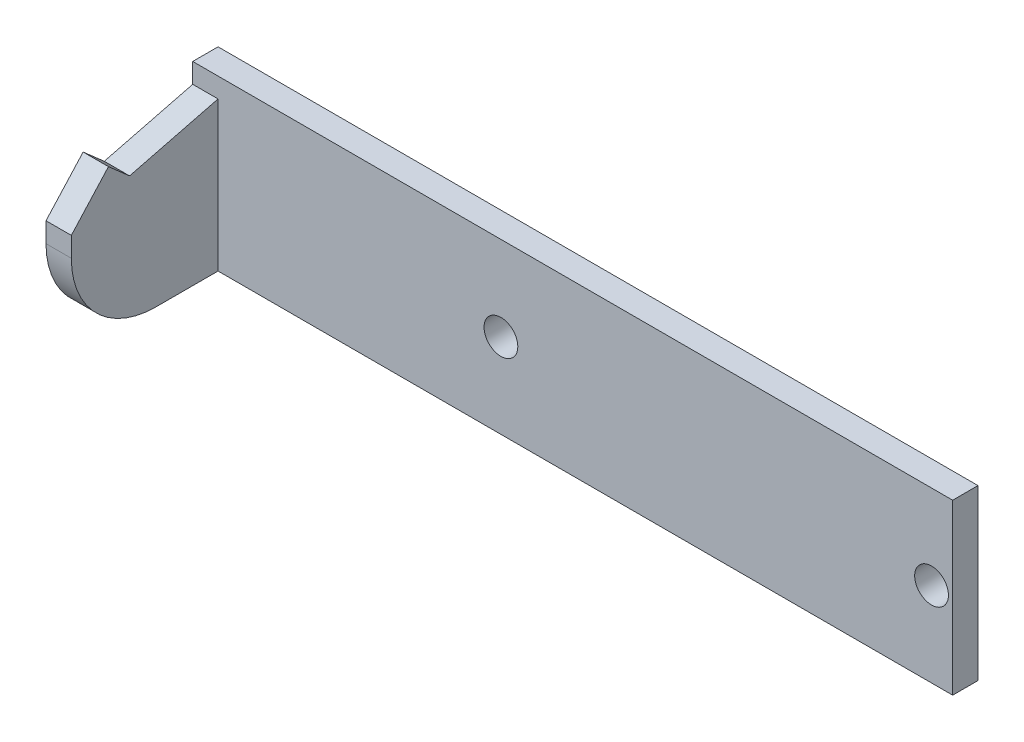
ISO-10303-21;
HEADER;
FILE_DESCRIPTION(('STEP AP214'),'2;1');
FILE_NAME('part.step','',(''),(''),'','','');
FILE_SCHEMA(('AUTOMOTIVE_DESIGN { 1 0 10303 214 1 1 1 1 }'));
ENDSEC;
DATA;
#1=APPLICATION_CONTEXT('core data for automotive mechanical design processes');
#2=APPLICATION_PROTOCOL_DEFINITION('international standard','automotive_design',2000,#1);
#3=PRODUCT_CONTEXT('',#1,'mechanical');
#4=PRODUCT('Part','Part','',(#3));
#5=PRODUCT_RELATED_PRODUCT_CATEGORY('part','',(#4));
#6=PRODUCT_DEFINITION_FORMATION('','',#4);
#7=PRODUCT_DEFINITION_CONTEXT('part definition',#1,'design');
#8=PRODUCT_DEFINITION('design','',#6,#7);
#9=PRODUCT_DEFINITION_SHAPE('','',#8);
#10=(LENGTH_UNIT() NAMED_UNIT(*) SI_UNIT(.MILLI.,.METRE.));
#11=(NAMED_UNIT(*) PLANE_ANGLE_UNIT() SI_UNIT($,.RADIAN.));
#12=(NAMED_UNIT(*) SI_UNIT($,.STERADIAN.) SOLID_ANGLE_UNIT());
#13=UNCERTAINTY_MEASURE_WITH_UNIT(LENGTH_MEASURE(1.E-05),#10,'distance_accuracy_value','');
#14=(GEOMETRIC_REPRESENTATION_CONTEXT(3) GLOBAL_UNCERTAINTY_ASSIGNED_CONTEXT((#13)) GLOBAL_UNIT_ASSIGNED_CONTEXT((#10,
#11,#12)) REPRESENTATION_CONTEXT('',''));
#15=CARTESIAN_POINT('',(0.,0.,0.));
#16=DIRECTION('',(0.,0.,1.));
#17=DIRECTION('',(1.,0.,0.));
#18=AXIS2_PLACEMENT_3D('',#15,#16,#17);
#19=CARTESIAN_POINT('',(-20.,-2.7997929379344,12.979015253484));
#20=DIRECTION('',(0.,0.750900789133745,-0.660415024721817));
#21=DIRECTION('',(1.,0.,0.));
#22=AXIS2_PLACEMENT_3D('',#19,#20,#21);
#23=PLANE('',#22);
#24=DIRECTION('',(0.,0.660415024721765,0.750900789133792));
#25=VECTOR('',#24,1.);
#26=CARTESIAN_POINT('',(-17.,-5.00000000000008,10.4773501530292));
#27=LINE('',#26,#25);
#28=CARTESIAN_POINT('',(-17.,-5.00000000000005,10.4773501530291));
#29=VERTEX_POINT('',#28);
#30=CARTESIAN_POINT('',(-17.,-2.79979293793436,12.9790152534844));
#31=VERTEX_POINT('',#30);
#32=EDGE_CURVE('E98',#29,#31,#27,.T.);
#33=ORIENTED_EDGE('',*,*,#32,.F.);
#34=DIRECTION('',(1.,0.,0.));
#35=VECTOR('',#34,1.);
#36=CARTESIAN_POINT('',(-14.595943068338,-5.,10.477350153029));
#37=LINE('',#36,#35);
#38=CARTESIAN_POINT('',(-20.,-5.,10.477350153029));
#39=VERTEX_POINT('',#38);
#40=EDGE_CURVE('E112',#39,#29,#37,.T.);
#41=ORIENTED_EDGE('',*,*,#40,.F.);
#42=DIRECTION('',(0.,-0.660415024721741,-0.750900789133812));
#43=VECTOR('',#42,1.);
#44=CARTESIAN_POINT('',(-20.,-2.79979293793444,12.9790152534845));
#45=LINE('',#44,#43);
#46=CARTESIAN_POINT('',(-20.,-2.79979293793436,12.9790152534843));
#47=VERTEX_POINT('',#46);
#48=EDGE_CURVE('E99',#47,#39,#45,.T.);
#49=ORIENTED_EDGE('',*,*,#48,.F.);
#50=DIRECTION('',(-1.,0.,0.));
#51=VECTOR('',#50,1.);
#52=CARTESIAN_POINT('',(-16.7261811258525,-2.7997929379344,12.979015253484));
#53=LINE('',#52,#51);
#54=EDGE_CURVE('E95',#31,#47,#53,.T.);
#55=ORIENTED_EDGE('',*,*,#54,.F.);
#56=EDGE_LOOP('',(#33,#41,#49,#55));
#57=FACE_BOUND('',#56,.T.);
#58=ADVANCED_FACE('F16',(#57),#23,.T.);
#59=CARTESIAN_POINT('',(-20.,-7.6515070721507,17.375881187618));
#60=DIRECTION('',(0.,0.6715194247389,0.740986951435946));
#61=DIRECTION('',(1.,0.,0.));
#62=AXIS2_PLACEMENT_3D('',#59,#60,#61);
#63=PLANE('',#62);
#64=DIRECTION('',(0.,-0.740986951435972,0.671519424738871));
#65=VECTOR('',#64,1.);
#66=CARTESIAN_POINT('',(-17.,-2.79979293793444,12.9790152534846));
#67=LINE('',#66,#65);
#68=CARTESIAN_POINT('',(-17.,-7.65150707215069,17.3758811876181));
#69=VERTEX_POINT('',#68);
#70=EDGE_CURVE('E103',#31,#69,#67,.T.);
#71=ORIENTED_EDGE('',*,*,#70,.F.);
#72=ORIENTED_EDGE('',*,*,#54,.T.);
#73=DIRECTION('',(0.,0.740986951435982,-0.67151942473886));
#74=VECTOR('',#73,1.);
#75=CARTESIAN_POINT('',(-20.,-7.65150707215073,17.375881187618));
#76=LINE('',#75,#74);
#77=CARTESIAN_POINT('',(-20.,-7.65150707215072,17.375881187618));
#78=VERTEX_POINT('',#77);
#79=EDGE_CURVE('E117',#78,#47,#76,.T.);
#80=ORIENTED_EDGE('',*,*,#79,.F.);
#81=DIRECTION('',(-1.,0.,0.));
#82=VECTOR('',#81,1.);
#83=CARTESIAN_POINT('',(-18.5,-7.65150707215072,17.375881187618));
#84=LINE('',#83,#82);
#85=EDGE_CURVE('E89',#69,#78,#84,.T.);
#86=ORIENTED_EDGE('',*,*,#85,.F.);
#87=EDGE_LOOP('',(#71,#72,#80,#86));
#88=FACE_BOUND('',#87,.T.);
#89=ADVANCED_FACE('F104',(#88),#63,.T.);
#90=CARTESIAN_POINT('',(-20.,-10.,17.375881187618));
#91=DIRECTION('',(0.,0.,1.));
#92=DIRECTION('',(1.,0.,0.));
#93=AXIS2_PLACEMENT_3D('',#90,#91,#92);
#94=PLANE('',#93);
#95=DIRECTION('',(0.,-1.,0.));
#96=VECTOR('',#95,1.);
#97=CARTESIAN_POINT('',(-17.,-11.1733068314977,17.3758811876182));
#98=LINE('',#97,#96);
#99=CARTESIAN_POINT('',(-17.,-9.99999999999978,17.375881187618));
#100=VERTEX_POINT('',#99);
#101=EDGE_CURVE('E107',#69,#100,#98,.T.);
#102=ORIENTED_EDGE('',*,*,#101,.F.);
#103=ORIENTED_EDGE('',*,*,#85,.T.);
#104=DIRECTION('',(0.,1.,0.));
#105=VECTOR('',#104,1.);
#106=CARTESIAN_POINT('',(-20.,-10.187940593809,17.375881187618));
#107=LINE('',#106,#105);
#108=CARTESIAN_POINT('',(-20.,-9.99999999999978,17.3758811876179));
#109=VERTEX_POINT('',#108);
#110=EDGE_CURVE('E118',#109,#78,#107,.T.);
#111=ORIENTED_EDGE('',*,*,#110,.F.);
#112=DIRECTION('',(1.,0.,0.));
#113=VECTOR('',#112,1.);
#114=CARTESIAN_POINT('',(-18.5,-9.99999999999956,17.3758811876178));
#115=LINE('',#114,#113);
#116=EDGE_CURVE('E139',#109,#100,#115,.T.);
#117=ORIENTED_EDGE('',*,*,#116,.T.);
#118=EDGE_LOOP('',(#102,#103,#111,#117));
#119=FACE_BOUND('',#118,.T.);
#120=ADVANCED_FACE('F278',(#119),#94,.T.);
#121=CARTESIAN_POINT('',(-20.,-10.,7.3758811876178));
#122=DIRECTION('',(1.,0.,0.));
#123=DIRECTION('',(0.,0.,-1.));
#124=AXIS2_PLACEMENT_3D('',#121,#122,#123);
#125=CYLINDRICAL_SURFACE('',#124,10.);
#126=CARTESIAN_POINT('',(-20.,-10.,7.3758811876178));
#127=DIRECTION('',(1.,0.,0.));
#128=DIRECTION('',(0.,0.,-1.));
#129=AXIS2_PLACEMENT_3D('',#126,#127,#128);
#130=CIRCLE('',#129,10.);
#131=CARTESIAN_POINT('',(-20.,-20.0000000000002,7.3758811876178));
#132=VERTEX_POINT('',#131);
#133=EDGE_CURVE('E20',#132,#109,#130,.F.);
#134=ORIENTED_EDGE('',*,*,#133,.F.);
#135=DIRECTION('',(-1.,0.,0.));
#136=VECTOR('',#135,1.);
#137=CARTESIAN_POINT('',(25.,-20.,7.3758811876178));
#138=LINE('',#137,#136);
#139=CARTESIAN_POINT('',(-17.,-20.,7.3758811876178));
#140=VERTEX_POINT('',#139);
#141=EDGE_CURVE('E61',#140,#132,#138,.T.);
#142=ORIENTED_EDGE('',*,*,#141,.F.);
#143=CARTESIAN_POINT('',(-17.,-10.,7.3758811876178));
#144=DIRECTION('',(1.,0.,0.));
#145=DIRECTION('',(0.,0.,-1.));
#146=AXIS2_PLACEMENT_3D('',#143,#144,#145);
#147=CIRCLE('',#146,10.);
#148=EDGE_CURVE('E134',#100,#140,#147,.T.);
#149=ORIENTED_EDGE('',*,*,#148,.F.);
#150=ORIENTED_EDGE('',*,*,#116,.F.);
#151=EDGE_LOOP('',(#134,#142,#149,#150));
#152=FACE_BOUND('',#151,.T.);
#153=ADVANCED_FACE('F225',(#152),#125,.T.);
#154=CARTESIAN_POINT('',(70.,-20.,-3.));
#155=DIRECTION('',(0.,0.,-1.));
#156=DIRECTION('',(-1.,0.,0.));
#157=AXIS2_PLACEMENT_3D('',#154,#155,#156);
#158=PLANE('',#157);
#159=CARTESIAN_POINT('',(16.5,-10.,-3.));
#160=DIRECTION('',(0.,0.,1.));
#161=DIRECTION('',(1.,0.,0.));
#162=AXIS2_PLACEMENT_3D('',#159,#160,#161);
#163=CIRCLE('',#162,2.);
#164=CARTESIAN_POINT('',(18.5,-10.,-3.));
#165=VERTEX_POINT('',#164);
#166=EDGE_CURVE('E144',#165,#165,#163,.F.);
#167=ORIENTED_EDGE('',*,*,#166,.F.);
#168=EDGE_LOOP('',(#167));
#169=FACE_BOUND('',#168,.T.);
#170=CARTESIAN_POINT('',(67.5,-10.,-3.));
#171=DIRECTION('',(0.,0.,1.));
#172=DIRECTION('',(1.,0.,0.));
#173=AXIS2_PLACEMENT_3D('',#170,#171,#172);
#174=CIRCLE('',#173,2.);
#175=CARTESIAN_POINT('',(69.5,-10.,-3.));
#176=VERTEX_POINT('',#175);
#177=EDGE_CURVE('E133',#176,#176,#174,.F.);
#178=ORIENTED_EDGE('',*,*,#177,.F.);
#179=EDGE_LOOP('',(#178));
#180=FACE_BOUND('',#179,.T.);
#181=DIRECTION('',(0.,1.,0.));
#182=VECTOR('',#181,1.);
#183=CARTESIAN_POINT('',(70.,-10.,-3.));
#184=LINE('',#183,#182);
#185=CARTESIAN_POINT('',(70.,-20.,-3.00000000000003));
#186=VERTEX_POINT('',#185);
#187=CARTESIAN_POINT('',(70.,0.,-2.99999999999998));
#188=VERTEX_POINT('',#187);
#189=EDGE_CURVE('E194',#186,#188,#184,.T.);
#190=ORIENTED_EDGE('',*,*,#189,.F.);
#191=DIRECTION('',(1.,0.,0.));
#192=VECTOR('',#191,1.);
#193=CARTESIAN_POINT('',(25.,-20.,-3.00000000000008));
#194=LINE('',#193,#192);
#195=CARTESIAN_POINT('',(-20.,-20.0000000000002,-3.00000000000003));
#196=VERTEX_POINT('',#195);
#197=EDGE_CURVE('E71',#196,#186,#194,.T.);
#198=ORIENTED_EDGE('',*,*,#197,.F.);
#199=DIRECTION('',(0.,-1.,0.));
#200=VECTOR('',#199,1.);
#201=CARTESIAN_POINT('',(-20.,-10.187940593809,-3.));
#202=LINE('',#201,#200);
#203=CARTESIAN_POINT('',(-20.,0.,-2.99999999999999));
#204=VERTEX_POINT('',#203);
#205=EDGE_CURVE('E128',#204,#196,#202,.T.);
#206=ORIENTED_EDGE('',*,*,#205,.F.);
#207=DIRECTION('',(-1.,0.,0.));
#208=VECTOR('',#207,1.);
#209=CARTESIAN_POINT('',(25.,0.,-2.99999999999997));
#210=LINE('',#209,#208);
#211=EDGE_CURVE('E181',#188,#204,#210,.T.);
#212=ORIENTED_EDGE('',*,*,#211,.F.);
#213=EDGE_LOOP('',(#190,#198,#206,#212));
#214=FACE_BOUND('',#213,.T.);
#215=ADVANCED_FACE('F282',(#169,#180,#214),#158,.T.);
#216=CARTESIAN_POINT('',(-20.,-20.,7.3758811876178));
#217=DIRECTION('',(0.,-1.,0.));
#218=DIRECTION('',(0.,0.,-1.));
#219=AXIS2_PLACEMENT_3D('',#216,#217,#218);
#220=PLANE('',#219);
#221=ORIENTED_EDGE('',*,*,#197,.T.);
#222=DIRECTION('',(0.,0.,-1.));
#223=VECTOR('',#222,1.);
#224=CARTESIAN_POINT('',(70.,-20.,-10.));
#225=LINE('',#224,#223);
#226=CARTESIAN_POINT('',(70.,-20.,0.));
#227=VERTEX_POINT('',#226);
#228=EDGE_CURVE('E171',#227,#186,#225,.T.);
#229=ORIENTED_EDGE('',*,*,#228,.F.);
#230=DIRECTION('',(1.,0.,0.));
#231=VECTOR('',#230,1.);
#232=CARTESIAN_POINT('',(25.,-20.,0.));
#233=LINE('',#232,#231);
#234=CARTESIAN_POINT('',(-17.,-20.,0.));
#235=VERTEX_POINT('',#234);
#236=EDGE_CURVE('E140',#235,#227,#233,.T.);
#237=ORIENTED_EDGE('',*,*,#236,.F.);
#238=DIRECTION('',(0.,0.,-1.));
#239=VECTOR('',#238,1.);
#240=CARTESIAN_POINT('',(-17.,-20.,8.8266931685025));
#241=LINE('',#240,#239);
#242=EDGE_CURVE('E131',#140,#235,#241,.T.);
#243=ORIENTED_EDGE('',*,*,#242,.F.);
#244=ORIENTED_EDGE('',*,*,#141,.T.);
#245=DIRECTION('',(0.,0.,1.));
#246=VECTOR('',#245,1.);
#247=CARTESIAN_POINT('',(-20.,-20.0000000000003,7.187940593809));
#248=LINE('',#247,#246);
#249=EDGE_CURVE('E124',#196,#132,#248,.T.);
#250=ORIENTED_EDGE('',*,*,#249,.F.);
#251=EDGE_LOOP('',(#221,#229,#237,#243,#244,#250));
#252=FACE_BOUND('',#251,.T.);
#253=ADVANCED_FACE('F227',(#252),#220,.T.);
#254=CARTESIAN_POINT('',(70.,-20.,0.));
#255=DIRECTION('',(1.,0.,0.));
#256=DIRECTION('',(0.,0.,-1.));
#257=AXIS2_PLACEMENT_3D('',#254,#255,#256);
#258=PLANE('',#257);
#259=ORIENTED_EDGE('',*,*,#189,.T.);
#260=DIRECTION('',(0.,0.,-1.));
#261=VECTOR('',#260,1.);
#262=CARTESIAN_POINT('',(70.,0.,-45.));
#263=LINE('',#262,#261);
#264=CARTESIAN_POINT('',(70.,0.,0.));
#265=VERTEX_POINT('',#264);
#266=EDGE_CURVE('E185',#265,#188,#263,.T.);
#267=ORIENTED_EDGE('',*,*,#266,.F.);
#268=DIRECTION('',(0.,1.,0.));
#269=VECTOR('',#268,1.);
#270=CARTESIAN_POINT('',(70.,25.,0.));
#271=LINE('',#270,#269);
#272=EDGE_CURVE('E143',#227,#265,#271,.T.);
#273=ORIENTED_EDGE('',*,*,#272,.F.);
#274=ORIENTED_EDGE('',*,*,#228,.T.);
#275=EDGE_LOOP('',(#259,#267,#273,#274));
#276=FACE_BOUND('',#275,.T.);
#277=ADVANCED_FACE('F288',(#276),#258,.T.);
#278=CARTESIAN_POINT('',(70.,0.,0.));
#279=DIRECTION('',(0.,1.,0.));
#280=DIRECTION('',(0.,0.,-1.));
#281=AXIS2_PLACEMENT_3D('',#278,#279,#280);
#282=PLANE('',#281);
#283=ORIENTED_EDGE('',*,*,#211,.T.);
#284=DIRECTION('',(0.,0.,-1.));
#285=VECTOR('',#284,1.);
#286=CARTESIAN_POINT('',(-20.,0.,7.187940593809));
#287=LINE('',#286,#285);
#288=CARTESIAN_POINT('',(-20.,0.,0.));
#289=VERTEX_POINT('',#288);
#290=EDGE_CURVE('E176',#289,#204,#287,.T.);
#291=ORIENTED_EDGE('',*,*,#290,.F.);
#292=DIRECTION('',(-1.,0.,0.));
#293=VECTOR('',#292,1.);
#294=CARTESIAN_POINT('',(25.,-1.94289029309402E-13,0.));
#295=LINE('',#294,#293);
#296=EDGE_CURVE('E167',#265,#289,#295,.T.);
#297=ORIENTED_EDGE('',*,*,#296,.F.);
#298=ORIENTED_EDGE('',*,*,#266,.T.);
#299=EDGE_LOOP('',(#283,#291,#297,#298));
#300=FACE_BOUND('',#299,.T.);
#301=ADVANCED_FACE('F242',(#300),#282,.T.);
#302=CARTESIAN_POINT('',(-20.,0.,17.375881187618));
#303=DIRECTION('',(-1.,0.,0.));
#304=DIRECTION('',(0.,0.,-1.));
#305=AXIS2_PLACEMENT_3D('',#302,#303,#304);
#306=PLANE('',#305);
#307=ORIENTED_EDGE('',*,*,#48,.T.);
#308=DIRECTION('',(0.,-0.245499480349527,0.969396722270151));
#309=VECTOR('',#308,1.);
#310=CARTESIAN_POINT('',(-20.,-3.6733068314977,5.2386750765145));
#311=LINE('',#310,#309);
#312=CARTESIAN_POINT('',(-20.,-2.34661366299535,0.));
#313=VERTEX_POINT('',#312);
#314=EDGE_CURVE('E116',#313,#39,#311,.T.);
#315=ORIENTED_EDGE('',*,*,#314,.F.);
#316=DIRECTION('',(0.,-1.,0.));
#317=VECTOR('',#316,1.);
#318=CARTESIAN_POINT('',(-20.,25.,0.));
#319=LINE('',#318,#317);
#320=EDGE_CURVE('E158',#289,#313,#319,.T.);
#321=ORIENTED_EDGE('',*,*,#320,.F.);
#322=ORIENTED_EDGE('',*,*,#290,.T.);
#323=ORIENTED_EDGE('',*,*,#205,.T.);
#324=ORIENTED_EDGE('',*,*,#249,.T.);
#325=ORIENTED_EDGE('',*,*,#133,.T.);
#326=ORIENTED_EDGE('',*,*,#110,.T.);
#327=ORIENTED_EDGE('',*,*,#79,.T.);
#328=EDGE_LOOP('',(#307,#315,#321,#322,#323,#324,#325,#326,#327));
#329=FACE_BOUND('',#328,.T.);
#330=ADVANCED_FACE('F244',(#329),#306,.T.);
#331=CARTESIAN_POINT('',(-20.,-5.,10.477350153029));
#332=DIRECTION('',(0.,0.969396722270151,0.245499480349527));
#333=DIRECTION('',(1.,0.,0.));
#334=AXIS2_PLACEMENT_3D('',#331,#332,#333);
#335=PLANE('',#334);
#336=DIRECTION('',(0.,-0.245499480349531,0.96939672227015));
#337=VECTOR('',#336,1.);
#338=CARTESIAN_POINT('',(-17.,-2.3466136629954,0.));
#339=LINE('',#338,#337);
#340=CARTESIAN_POINT('',(-17.,-2.34661366299535,0.));
#341=VERTEX_POINT('',#340);
#342=EDGE_CURVE('E35',#341,#29,#339,.T.);
#343=ORIENTED_EDGE('',*,*,#342,.F.);
#344=DIRECTION('',(1.,0.,0.));
#345=VECTOR('',#344,1.);
#346=CARTESIAN_POINT('',(25.,-2.34661366299529,0.));
#347=LINE('',#346,#345);
#348=EDGE_CURVE('E150',#313,#341,#347,.T.);
#349=ORIENTED_EDGE('',*,*,#348,.F.);
#350=ORIENTED_EDGE('',*,*,#314,.T.);
#351=ORIENTED_EDGE('',*,*,#40,.T.);
#352=EDGE_LOOP('',(#343,#349,#350,#351));
#353=FACE_BOUND('',#352,.T.);
#354=ADVANCED_FACE('F245',(#353),#335,.T.);
#355=CARTESIAN_POINT('',(-17.,-2.3466136629954,0.));
#356=DIRECTION('',(1.,0.,0.));
#357=DIRECTION('',(0.,0.,1.));
#358=AXIS2_PLACEMENT_3D('',#355,#356,#357);
#359=PLANE('',#358);
#360=ORIENTED_EDGE('',*,*,#242,.T.);
#361=DIRECTION('',(0.,-1.,0.));
#362=VECTOR('',#361,1.);
#363=CARTESIAN_POINT('',(-17.,25.,0.));
#364=LINE('',#363,#362);
#365=EDGE_CURVE('E147',#341,#235,#364,.T.);
#366=ORIENTED_EDGE('',*,*,#365,.F.);
#367=ORIENTED_EDGE('',*,*,#342,.T.);
#368=ORIENTED_EDGE('',*,*,#32,.T.);
#369=ORIENTED_EDGE('',*,*,#70,.T.);
#370=ORIENTED_EDGE('',*,*,#101,.T.);
#371=ORIENTED_EDGE('',*,*,#148,.T.);
#372=EDGE_LOOP('',(#360,#366,#367,#368,#369,#370,#371));
#373=FACE_BOUND('',#372,.T.);
#374=ADVANCED_FACE('F110',(#373),#359,.T.);
#375=CARTESIAN_POINT('',(67.5,-10.,-3.));
#376=DIRECTION('',(0.,0.,1.));
#377=DIRECTION('',(1.,0.,0.));
#378=AXIS2_PLACEMENT_3D('',#375,#376,#377);
#379=CYLINDRICAL_SURFACE('',#378,2.);
#380=ORIENTED_EDGE('',*,*,#177,.T.);
#381=EDGE_LOOP('',(#380));
#382=FACE_BOUND('',#381,.T.);
#383=CARTESIAN_POINT('',(67.5,-10.,0.));
#384=DIRECTION('',(0.,0.,1.));
#385=DIRECTION('',(1.,0.,0.));
#386=AXIS2_PLACEMENT_3D('',#383,#384,#385);
#387=CIRCLE('',#386,2.);
#388=CARTESIAN_POINT('',(69.5,-10.,0.));
#389=VERTEX_POINT('',#388);
#390=EDGE_CURVE('E26',#389,#389,#387,.F.);
#391=ORIENTED_EDGE('',*,*,#390,.F.);
#392=EDGE_LOOP('',(#391));
#393=FACE_BOUND('',#392,.T.);
#394=ADVANCED_FACE('F253',(#382,#393),#379,.F.);
#395=CARTESIAN_POINT('',(16.5,-10.,-3.));
#396=DIRECTION('',(0.,0.,1.));
#397=DIRECTION('',(1.,0.,0.));
#398=AXIS2_PLACEMENT_3D('',#395,#396,#397);
#399=CYLINDRICAL_SURFACE('',#398,2.);
#400=ORIENTED_EDGE('',*,*,#166,.T.);
#401=EDGE_LOOP('',(#400));
#402=FACE_BOUND('',#401,.T.);
#403=CARTESIAN_POINT('',(16.5,-10.,0.));
#404=DIRECTION('',(0.,0.,1.));
#405=DIRECTION('',(1.,0.,0.));
#406=AXIS2_PLACEMENT_3D('',#403,#404,#405);
#407=CIRCLE('',#406,2.);
#408=CARTESIAN_POINT('',(18.5,-10.,0.));
#409=VERTEX_POINT('',#408);
#410=EDGE_CURVE('E10',#409,#409,#407,.F.);
#411=ORIENTED_EDGE('',*,*,#410,.F.);
#412=EDGE_LOOP('',(#411));
#413=FACE_BOUND('',#412,.T.);
#414=ADVANCED_FACE('F256',(#402,#413),#399,.F.);
#415=CARTESIAN_POINT('',(-20.,-20.,0.));
#416=DIRECTION('',(0.,0.,1.));
#417=DIRECTION('',(1.,0.,0.));
#418=AXIS2_PLACEMENT_3D('',#415,#416,#417);
#419=PLANE('',#418);
#420=ORIENTED_EDGE('',*,*,#410,.T.);
#421=EDGE_LOOP('',(#420));
#422=FACE_BOUND('',#421,.T.);
#423=ORIENTED_EDGE('',*,*,#390,.T.);
#424=EDGE_LOOP('',(#423));
#425=FACE_BOUND('',#424,.T.);
#426=ORIENTED_EDGE('',*,*,#348,.T.);
#427=ORIENTED_EDGE('',*,*,#365,.T.);
#428=ORIENTED_EDGE('',*,*,#236,.T.);
#429=ORIENTED_EDGE('',*,*,#272,.T.);
#430=ORIENTED_EDGE('',*,*,#296,.T.);
#431=ORIENTED_EDGE('',*,*,#320,.T.);
#432=EDGE_LOOP('',(#426,#427,#428,#429,#430,#431));
#433=FACE_BOUND('',#432,.T.);
#434=ADVANCED_FACE('F18',(#422,#425,#433),#419,.T.);
#435=CLOSED_SHELL('',(#58,#89,#120,#153,#215,#253,#277,#301,#330,#354,#374,#394,#414,#434));
#436=MANIFOLD_SOLID_BREP('B1',#435);
#437=ADVANCED_BREP_SHAPE_REPRESENTATION('',(#18,#436),#14);
#438=SHAPE_DEFINITION_REPRESENTATION(#9,#437);
ENDSEC;
END-ISO-10303-21;
